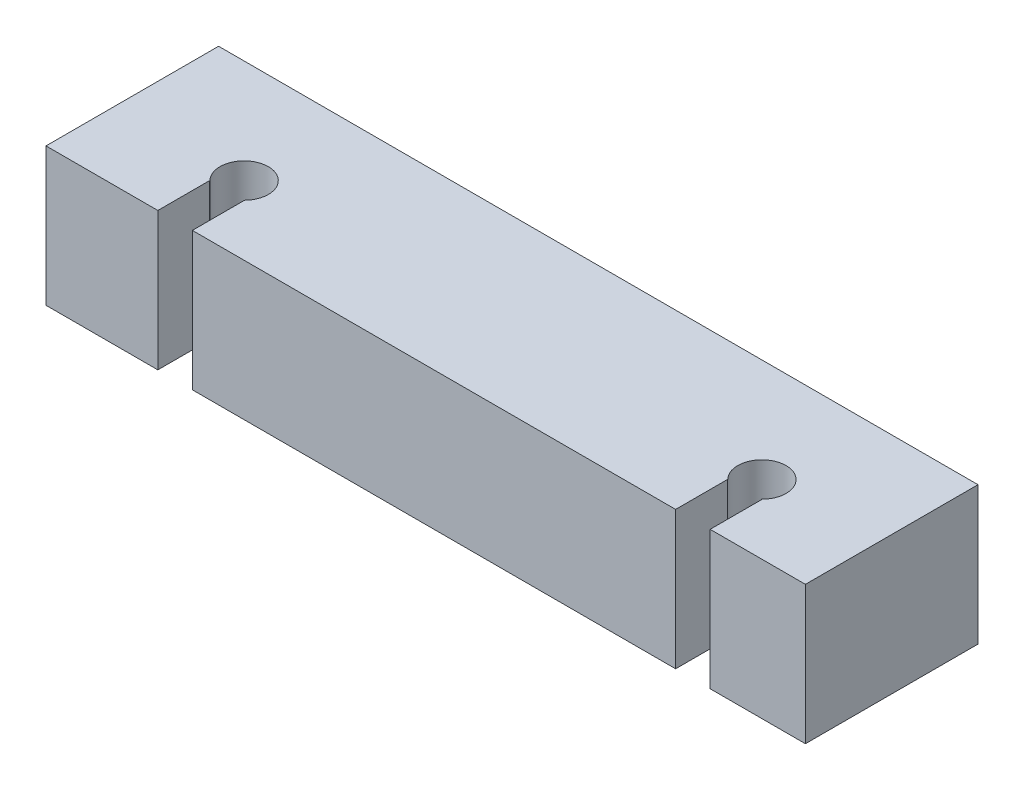
ISO-10303-21;
HEADER;
FILE_DESCRIPTION(('STEP AP214'),'2;1');
FILE_NAME('part.step','',(''),(''),'','','');
FILE_SCHEMA(('AUTOMOTIVE_DESIGN { 1 0 10303 214 1 1 1 1 }'));
ENDSEC;
DATA;
#1=APPLICATION_CONTEXT('core data for automotive mechanical design processes');
#2=APPLICATION_PROTOCOL_DEFINITION('international standard','automotive_design',2000,#1);
#3=PRODUCT_CONTEXT('',#1,'mechanical');
#4=PRODUCT('Part','Part','',(#3));
#5=PRODUCT_RELATED_PRODUCT_CATEGORY('part','',(#4));
#6=PRODUCT_DEFINITION_FORMATION('','',#4);
#7=PRODUCT_DEFINITION_CONTEXT('part definition',#1,'design');
#8=PRODUCT_DEFINITION('design','',#6,#7);
#9=PRODUCT_DEFINITION_SHAPE('','',#8);
#10=(LENGTH_UNIT() NAMED_UNIT(*) SI_UNIT(.MILLI.,.METRE.));
#11=(NAMED_UNIT(*) PLANE_ANGLE_UNIT() SI_UNIT($,.RADIAN.));
#12=(NAMED_UNIT(*) SI_UNIT($,.STERADIAN.) SOLID_ANGLE_UNIT());
#13=UNCERTAINTY_MEASURE_WITH_UNIT(LENGTH_MEASURE(1.E-05),#10,'distance_accuracy_value','');
#14=(GEOMETRIC_REPRESENTATION_CONTEXT(3) GLOBAL_UNCERTAINTY_ASSIGNED_CONTEXT((#13)) GLOBAL_UNIT_ASSIGNED_CONTEXT((#10,
#11,#12)) REPRESENTATION_CONTEXT('',''));
#15=CARTESIAN_POINT('',(0.,0.,0.));
#16=DIRECTION('',(0.,0.,1.));
#17=DIRECTION('',(1.,0.,0.));
#18=AXIS2_PLACEMENT_3D('',#15,#16,#17);
#19=CARTESIAN_POINT('',(0.,0.,100.));
#20=DIRECTION('',(0.,0.,-1.));
#21=DIRECTION('',(-1.,0.,0.));
#22=AXIS2_PLACEMENT_3D('',#19,#20,#21);
#23=PLANE('',#22);
#24=DIRECTION('',(0.,1.,0.));
#25=VECTOR('',#24,1.);
#26=CARTESIAN_POINT('',(-22.5,0.,100.));
#27=LINE('',#26,#25);
#28=CARTESIAN_POINT('',(-22.5,0.,100.));
#29=VERTEX_POINT('',#28);
#30=CARTESIAN_POINT('',(-22.5,10.,100.));
#31=VERTEX_POINT('',#30);
#32=EDGE_CURVE('E274',#29,#31,#27,.T.);
#33=ORIENTED_EDGE('',*,*,#32,.F.);
#34=DIRECTION('',(1.,0.,0.));
#35=VECTOR('',#34,1.);
#36=CARTESIAN_POINT('',(-72.5,0.,100.));
#37=LINE('',#36,#35);
#38=CARTESIAN_POINT('',(-14.4,0.,100.));
#39=VERTEX_POINT('',#38);
#40=EDGE_CURVE('E239',#29,#39,#37,.T.);
#41=ORIENTED_EDGE('',*,*,#40,.T.);
#42=DIRECTION('',(0.,1.,0.));
#43=VECTOR('',#42,1.);
#44=CARTESIAN_POINT('',(-14.4,0.,100.));
#45=LINE('',#44,#43);
#46=CARTESIAN_POINT('',(-14.4,10.,100.));
#47=VERTEX_POINT('',#46);
#48=EDGE_CURVE('E221',#39,#47,#45,.T.);
#49=ORIENTED_EDGE('',*,*,#48,.T.);
#50=DIRECTION('',(-1.,0.,0.));
#51=VECTOR('',#50,1.);
#52=CARTESIAN_POINT('',(-72.5,10.,100.));
#53=LINE('',#52,#51);
#54=EDGE_CURVE('E167',#47,#31,#53,.T.);
#55=ORIENTED_EDGE('',*,*,#54,.T.);
#56=EDGE_LOOP('',(#33,#41,#49,#55));
#57=FACE_BOUND('',#56,.T.);
#58=ADVANCED_FACE('F35',(#57),#23,.F.);
#59=CARTESIAN_POINT('',(0.,10.,0.));
#60=DIRECTION('',(0.,1.,0.));
#61=DIRECTION('',(0.,0.,1.));
#62=AXIS2_PLACEMENT_3D('',#59,#60,#61);
#63=PLANE('',#62);
#64=DIRECTION('',(0.,0.,1.));
#65=VECTOR('',#64,1.);
#66=CARTESIAN_POINT('',(32.5,10.,87.5));
#67=LINE('',#66,#65);
#68=CARTESIAN_POINT('',(32.5,10.,87.5));
#69=VERTEX_POINT('',#68);
#70=CARTESIAN_POINT('',(32.5,10.,100.));
#71=VERTEX_POINT('',#70);
#72=EDGE_CURVE('E50',#69,#71,#67,.T.);
#73=ORIENTED_EDGE('',*,*,#72,.F.);
#74=DIRECTION('',(-1.,0.,0.));
#75=VECTOR('',#74,1.);
#76=CARTESIAN_POINT('',(72.5,10.,87.5));
#77=LINE('',#76,#75);
#78=CARTESIAN_POINT('',(-22.5,10.,87.5));
#79=VERTEX_POINT('',#78);
#80=EDGE_CURVE('E57',#69,#79,#77,.T.);
#81=ORIENTED_EDGE('',*,*,#80,.T.);
#82=DIRECTION('',(0.,0.,-1.));
#83=VECTOR('',#82,1.);
#84=CARTESIAN_POINT('',(-22.5,10.,100.));
#85=LINE('',#84,#83);
#86=EDGE_CURVE('E278',#31,#79,#85,.T.);
#87=ORIENTED_EDGE('',*,*,#86,.F.);
#88=ORIENTED_EDGE('',*,*,#54,.F.);
#89=DIRECTION('',(0.,0.,-1.));
#90=VECTOR('',#89,1.);
#91=CARTESIAN_POINT('',(-14.4,10.,96.25));
#92=LINE('',#91,#90);
#93=CARTESIAN_POINT('',(-14.4,10.,96.25));
#94=VERTEX_POINT('',#93);
#95=EDGE_CURVE('E192',#47,#94,#92,.T.);
#96=ORIENTED_EDGE('',*,*,#95,.T.);
#97=DIRECTION('',(1.,0.,0.));
#98=VECTOR('',#97,1.);
#99=CARTESIAN_POINT('',(-14.4,10.,96.25));
#100=LINE('',#99,#98);
#101=CARTESIAN_POINT('',(-14.3747448713916,10.,96.25));
#102=VERTEX_POINT('',#101);
#103=EDGE_CURVE('E190',#94,#102,#100,.T.);
#104=ORIENTED_EDGE('',*,*,#103,.T.);
#105=CARTESIAN_POINT('',(-13.15,10.,95.));
#106=DIRECTION('',(0.,1.,0.));
#107=DIRECTION('',(0.,0.,1.));
#108=AXIS2_PLACEMENT_3D('',#105,#106,#107);
#109=CIRCLE('',#108,1.75);
#110=CARTESIAN_POINT('',(-11.9252551286084,10.,96.25));
#111=VERTEX_POINT('',#110);
#112=EDGE_CURVE('E188',#102,#111,#109,.F.);
#113=ORIENTED_EDGE('',*,*,#112,.T.);
#114=DIRECTION('',(1.,0.,0.));
#115=VECTOR('',#114,1.);
#116=CARTESIAN_POINT('',(-14.4,10.,96.25));
#117=LINE('',#116,#115);
#118=CARTESIAN_POINT('',(-11.9,10.,96.25));
#119=VERTEX_POINT('',#118);
#120=EDGE_CURVE('E184',#111,#119,#117,.T.);
#121=ORIENTED_EDGE('',*,*,#120,.T.);
#122=DIRECTION('',(0.,0.,1.));
#123=VECTOR('',#122,1.);
#124=CARTESIAN_POINT('',(-11.9,10.,96.25));
#125=LINE('',#124,#123);
#126=CARTESIAN_POINT('',(-11.9,10.,100.));
#127=VERTEX_POINT('',#126);
#128=EDGE_CURVE('E186',#119,#127,#125,.T.);
#129=ORIENTED_EDGE('',*,*,#128,.T.);
#130=CARTESIAN_POINT('',(23.1,10.,100.));
#131=VERTEX_POINT('',#130);
#132=EDGE_CURVE('E174',#131,#127,#53,.T.);
#133=ORIENTED_EDGE('',*,*,#132,.F.);
#134=DIRECTION('',(0.,0.,-1.));
#135=VECTOR('',#134,1.);
#136=CARTESIAN_POINT('',(23.1,10.,96.25));
#137=LINE('',#136,#135);
#138=CARTESIAN_POINT('',(23.1,10.,96.25));
#139=VERTEX_POINT('',#138);
#140=EDGE_CURVE('E182',#131,#139,#137,.T.);
#141=ORIENTED_EDGE('',*,*,#140,.T.);
#142=DIRECTION('',(1.,0.,0.));
#143=VECTOR('',#142,1.);
#144=CARTESIAN_POINT('',(23.1,10.,96.25));
#145=LINE('',#144,#143);
#146=CARTESIAN_POINT('',(23.1252551286084,10.,96.25));
#147=VERTEX_POINT('',#146);
#148=EDGE_CURVE('E180',#139,#147,#145,.T.);
#149=ORIENTED_EDGE('',*,*,#148,.T.);
#150=CARTESIAN_POINT('',(24.35,10.,95.));
#151=DIRECTION('',(0.,1.,0.));
#152=DIRECTION('',(0.,0.,1.));
#153=AXIS2_PLACEMENT_3D('',#150,#151,#152);
#154=CIRCLE('',#153,1.75);
#155=CARTESIAN_POINT('',(25.5747448713916,10.,96.25));
#156=VERTEX_POINT('',#155);
#157=EDGE_CURVE('E178',#147,#156,#154,.F.);
#158=ORIENTED_EDGE('',*,*,#157,.T.);
#159=DIRECTION('',(1.,0.,0.));
#160=VECTOR('',#159,1.);
#161=CARTESIAN_POINT('',(23.1,10.,96.25));
#162=LINE('',#161,#160);
#163=CARTESIAN_POINT('',(25.6,10.,96.25));
#164=VERTEX_POINT('',#163);
#165=EDGE_CURVE('E173',#156,#164,#162,.T.);
#166=ORIENTED_EDGE('',*,*,#165,.T.);
#167=DIRECTION('',(0.,0.,1.));
#168=VECTOR('',#167,1.);
#169=CARTESIAN_POINT('',(25.6,10.,96.25));
#170=LINE('',#169,#168);
#171=CARTESIAN_POINT('',(25.6,10.,100.));
#172=VERTEX_POINT('',#171);
#173=EDGE_CURVE('E176',#164,#172,#170,.T.);
#174=ORIENTED_EDGE('',*,*,#173,.T.);
#175=EDGE_CURVE('E158',#71,#172,#53,.T.);
#176=ORIENTED_EDGE('',*,*,#175,.F.);
#177=EDGE_LOOP('',(#73,#81,#87,#88,#96,#104,#113,#121,#129,#133,#141,#149,#158,#166,#174,#176));
#178=FACE_BOUND('',#177,.T.);
#179=ADVANCED_FACE('F156',(#178),#63,.T.);
#180=CARTESIAN_POINT('',(0.,0.,0.));
#181=DIRECTION('',(0.,1.,0.));
#182=DIRECTION('',(0.,0.,1.));
#183=AXIS2_PLACEMENT_3D('',#180,#181,#182);
#184=PLANE('',#183);
#185=DIRECTION('',(1.,0.,0.));
#186=VECTOR('',#185,1.);
#187=CARTESIAN_POINT('',(72.5,0.,87.5));
#188=LINE('',#187,#186);
#189=CARTESIAN_POINT('',(-22.5,0.,87.5));
#190=VERTEX_POINT('',#189);
#191=CARTESIAN_POINT('',(32.5,0.,87.5));
#192=VERTEX_POINT('',#191);
#193=EDGE_CURVE('E164',#190,#192,#188,.T.);
#194=ORIENTED_EDGE('',*,*,#193,.T.);
#195=DIRECTION('',(0.,0.,-1.));
#196=VECTOR('',#195,1.);
#197=CARTESIAN_POINT('',(32.5,0.,87.5));
#198=LINE('',#197,#196);
#199=CARTESIAN_POINT('',(32.5,0.,100.));
#200=VERTEX_POINT('',#199);
#201=EDGE_CURVE('E150',#200,#192,#198,.T.);
#202=ORIENTED_EDGE('',*,*,#201,.F.);
#203=CARTESIAN_POINT('',(25.6,0.,100.));
#204=VERTEX_POINT('',#203);
#205=EDGE_CURVE('E238',#204,#200,#37,.T.);
#206=ORIENTED_EDGE('',*,*,#205,.F.);
#207=DIRECTION('',(0.,0.,-1.));
#208=VECTOR('',#207,1.);
#209=CARTESIAN_POINT('',(25.6,0.,0.));
#210=LINE('',#209,#208);
#211=CARTESIAN_POINT('',(25.6,0.,96.25));
#212=VERTEX_POINT('',#211);
#213=EDGE_CURVE('E218',#204,#212,#210,.T.);
#214=ORIENTED_EDGE('',*,*,#213,.T.);
#215=DIRECTION('',(-1.,0.,0.));
#216=VECTOR('',#215,1.);
#217=CARTESIAN_POINT('',(0.,0.,96.25));
#218=LINE('',#217,#216);
#219=CARTESIAN_POINT('',(25.5747448713916,0.,96.25));
#220=VERTEX_POINT('',#219);
#221=EDGE_CURVE('E209',#212,#220,#218,.T.);
#222=ORIENTED_EDGE('',*,*,#221,.T.);
#223=CARTESIAN_POINT('',(24.35,0.,95.));
#224=DIRECTION('',(0.,1.,0.));
#225=DIRECTION('',(0.,0.,1.));
#226=AXIS2_PLACEMENT_3D('',#223,#224,#225);
#227=CIRCLE('',#226,1.75);
#228=CARTESIAN_POINT('',(23.1252551286084,0.,96.25));
#229=VERTEX_POINT('',#228);
#230=EDGE_CURVE('E232',#220,#229,#227,.T.);
#231=ORIENTED_EDGE('',*,*,#230,.T.);
#232=CARTESIAN_POINT('',(23.1,0.,96.25));
#233=VERTEX_POINT('',#232);
#234=EDGE_CURVE('E206',#229,#233,#218,.T.);
#235=ORIENTED_EDGE('',*,*,#234,.T.);
#236=DIRECTION('',(0.,0.,1.));
#237=VECTOR('',#236,1.);
#238=CARTESIAN_POINT('',(23.1,0.,0.));
#239=LINE('',#238,#237);
#240=CARTESIAN_POINT('',(23.1,0.,100.));
#241=VERTEX_POINT('',#240);
#242=EDGE_CURVE('E213',#233,#241,#239,.T.);
#243=ORIENTED_EDGE('',*,*,#242,.T.);
#244=CARTESIAN_POINT('',(-11.9,0.,100.));
#245=VERTEX_POINT('',#244);
#246=EDGE_CURVE('E242',#245,#241,#37,.T.);
#247=ORIENTED_EDGE('',*,*,#246,.F.);
#248=DIRECTION('',(0.,0.,-1.));
#249=VECTOR('',#248,1.);
#250=CARTESIAN_POINT('',(-11.9,0.,0.));
#251=LINE('',#250,#249);
#252=CARTESIAN_POINT('',(-11.9,0.,96.25));
#253=VERTEX_POINT('',#252);
#254=EDGE_CURVE('E229',#245,#253,#251,.T.);
#255=ORIENTED_EDGE('',*,*,#254,.T.);
#256=DIRECTION('',(-1.,0.,0.));
#257=VECTOR('',#256,1.);
#258=CARTESIAN_POINT('',(0.,0.,96.25));
#259=LINE('',#258,#257);
#260=CARTESIAN_POINT('',(-11.9252551286084,0.,96.25));
#261=VERTEX_POINT('',#260);
#262=EDGE_CURVE('E205',#253,#261,#259,.T.);
#263=ORIENTED_EDGE('',*,*,#262,.T.);
#264=CARTESIAN_POINT('',(-13.15,0.,95.));
#265=DIRECTION('',(0.,1.,0.));
#266=DIRECTION('',(0.,0.,1.));
#267=AXIS2_PLACEMENT_3D('',#264,#265,#266);
#268=CIRCLE('',#267,1.75);
#269=CARTESIAN_POINT('',(-14.3747448713916,0.,96.25));
#270=VERTEX_POINT('',#269);
#271=EDGE_CURVE('E235',#261,#270,#268,.T.);
#272=ORIENTED_EDGE('',*,*,#271,.T.);
#273=CARTESIAN_POINT('',(-14.4,0.,96.25));
#274=VERTEX_POINT('',#273);
#275=EDGE_CURVE('E197',#270,#274,#259,.T.);
#276=ORIENTED_EDGE('',*,*,#275,.T.);
#277=DIRECTION('',(0.,0.,1.));
#278=VECTOR('',#277,1.);
#279=CARTESIAN_POINT('',(-14.4,0.,0.));
#280=LINE('',#279,#278);
#281=EDGE_CURVE('E224',#274,#39,#280,.T.);
#282=ORIENTED_EDGE('',*,*,#281,.T.);
#283=ORIENTED_EDGE('',*,*,#40,.F.);
#284=DIRECTION('',(0.,0.,1.));
#285=VECTOR('',#284,1.);
#286=CARTESIAN_POINT('',(-22.5,0.,87.5));
#287=LINE('',#286,#285);
#288=EDGE_CURVE('E165',#190,#29,#287,.T.);
#289=ORIENTED_EDGE('',*,*,#288,.F.);
#290=EDGE_LOOP('',(#194,#202,#206,#214,#222,#231,#235,#243,#247,#255,#263,#272,#276,#282,#283,#289));
#291=FACE_BOUND('',#290,.T.);
#292=ADVANCED_FACE('F37',(#291),#184,.F.);
#293=CARTESIAN_POINT('',(0.,0.,87.5));
#294=DIRECTION('',(0.,0.,1.));
#295=DIRECTION('',(1.,0.,0.));
#296=AXIS2_PLACEMENT_3D('',#293,#294,#295);
#297=PLANE('',#296);
#298=ORIENTED_EDGE('',*,*,#80,.F.);
#299=DIRECTION('',(0.,1.,0.));
#300=VECTOR('',#299,1.);
#301=CARTESIAN_POINT('',(32.5,10.,87.5));
#302=LINE('',#301,#300);
#303=EDGE_CURVE('E147',#192,#69,#302,.T.);
#304=ORIENTED_EDGE('',*,*,#303,.F.);
#305=ORIENTED_EDGE('',*,*,#193,.F.);
#306=DIRECTION('',(0.,-1.,0.));
#307=VECTOR('',#306,1.);
#308=CARTESIAN_POINT('',(-22.5,10.,87.5));
#309=LINE('',#308,#307);
#310=EDGE_CURVE('E163',#79,#190,#309,.T.);
#311=ORIENTED_EDGE('',*,*,#310,.F.);
#312=EDGE_LOOP('',(#298,#304,#305,#311));
#313=FACE_BOUND('',#312,.T.);
#314=ADVANCED_FACE('F162',(#313),#297,.F.);
#315=ORIENTED_EDGE('',*,*,#132,.T.);
#316=DIRECTION('',(0.,-1.,0.));
#317=VECTOR('',#316,1.);
#318=CARTESIAN_POINT('',(-11.9,0.,100.));
#319=LINE('',#318,#317);
#320=EDGE_CURVE('E227',#127,#245,#319,.T.);
#321=ORIENTED_EDGE('',*,*,#320,.T.);
#322=ORIENTED_EDGE('',*,*,#246,.T.);
#323=DIRECTION('',(0.,1.,0.));
#324=VECTOR('',#323,1.);
#325=CARTESIAN_POINT('',(23.1,0.,100.));
#326=LINE('',#325,#324);
#327=EDGE_CURVE('E210',#241,#131,#326,.T.);
#328=ORIENTED_EDGE('',*,*,#327,.T.);
#329=EDGE_LOOP('',(#315,#321,#322,#328));
#330=FACE_BOUND('',#329,.T.);
#331=ADVANCED_FACE('F316',(#330),#23,.F.);
#332=ORIENTED_EDGE('',*,*,#205,.T.);
#333=DIRECTION('',(0.,-1.,0.));
#334=VECTOR('',#333,1.);
#335=CARTESIAN_POINT('',(32.5,10.,100.));
#336=LINE('',#335,#334);
#337=EDGE_CURVE('E159',#71,#200,#336,.T.);
#338=ORIENTED_EDGE('',*,*,#337,.F.);
#339=ORIENTED_EDGE('',*,*,#175,.T.);
#340=DIRECTION('',(0.,-1.,0.));
#341=VECTOR('',#340,1.);
#342=CARTESIAN_POINT('',(25.6,0.,100.));
#343=LINE('',#342,#341);
#344=EDGE_CURVE('E216',#172,#204,#343,.T.);
#345=ORIENTED_EDGE('',*,*,#344,.T.);
#346=EDGE_LOOP('',(#332,#338,#339,#345));
#347=FACE_BOUND('',#346,.T.);
#348=ADVANCED_FACE('F272',(#347),#23,.F.);
#349=CARTESIAN_POINT('',(24.35,60.,95.));
#350=DIRECTION('',(0.,-1.,0.));
#351=DIRECTION('',(0.,0.,-1.));
#352=AXIS2_PLACEMENT_3D('',#349,#350,#351);
#353=CYLINDRICAL_SURFACE('',#352,1.75);
#354=ORIENTED_EDGE('',*,*,#157,.F.);
#355=DIRECTION('',(0.,-1.,0.));
#356=VECTOR('',#355,1.);
#357=CARTESIAN_POINT('',(23.1252551286084,60.,96.25));
#358=LINE('',#357,#356);
#359=EDGE_CURVE('E43',#147,#229,#358,.T.);
#360=ORIENTED_EDGE('',*,*,#359,.T.);
#361=ORIENTED_EDGE('',*,*,#230,.F.);
#362=DIRECTION('',(0.,-1.,0.));
#363=VECTOR('',#362,1.);
#364=CARTESIAN_POINT('',(25.5747448713916,60.,96.25));
#365=LINE('',#364,#363);
#366=EDGE_CURVE('E11',#220,#156,#365,.F.);
#367=ORIENTED_EDGE('',*,*,#366,.T.);
#368=EDGE_LOOP('',(#354,#360,#361,#367));
#369=FACE_BOUND('',#368,.T.);
#370=ADVANCED_FACE('F251',(#369),#353,.F.);
#371=CARTESIAN_POINT('',(-13.15,60.,95.));
#372=DIRECTION('',(0.,-1.,0.));
#373=DIRECTION('',(0.,0.,-1.));
#374=AXIS2_PLACEMENT_3D('',#371,#372,#373);
#375=CYLINDRICAL_SURFACE('',#374,1.75);
#376=ORIENTED_EDGE('',*,*,#112,.F.);
#377=DIRECTION('',(0.,-1.,0.));
#378=VECTOR('',#377,1.);
#379=CARTESIAN_POINT('',(-14.3747448713916,60.,96.25));
#380=LINE('',#379,#378);
#381=EDGE_CURVE('E241',#102,#270,#380,.T.);
#382=ORIENTED_EDGE('',*,*,#381,.T.);
#383=ORIENTED_EDGE('',*,*,#271,.F.);
#384=DIRECTION('',(0.,-1.,0.));
#385=VECTOR('',#384,1.);
#386=CARTESIAN_POINT('',(-11.9252551286084,60.,96.25));
#387=LINE('',#386,#385);
#388=EDGE_CURVE('E244',#261,#111,#387,.F.);
#389=ORIENTED_EDGE('',*,*,#388,.T.);
#390=EDGE_LOOP('',(#376,#382,#383,#389));
#391=FACE_BOUND('',#390,.T.);
#392=ADVANCED_FACE('F300',(#391),#375,.F.);
#393=CARTESIAN_POINT('',(-14.4,60.,96.25));
#394=DIRECTION('',(0.,0.,-1.));
#395=DIRECTION('',(-1.,0.,0.));
#396=AXIS2_PLACEMENT_3D('',#393,#394,#395);
#397=PLANE('',#396);
#398=ORIENTED_EDGE('',*,*,#103,.F.);
#399=DIRECTION('',(0.,-1.,0.));
#400=VECTOR('',#399,1.);
#401=CARTESIAN_POINT('',(-14.4,60.,96.25));
#402=LINE('',#401,#400);
#403=EDGE_CURVE('E198',#94,#274,#402,.T.);
#404=ORIENTED_EDGE('',*,*,#403,.T.);
#405=ORIENTED_EDGE('',*,*,#275,.F.);
#406=ORIENTED_EDGE('',*,*,#381,.F.);
#407=EDGE_LOOP('',(#398,#404,#405,#406));
#408=FACE_BOUND('',#407,.T.);
#409=ADVANCED_FACE('F296',(#408),#397,.F.);
#410=CARTESIAN_POINT('',(-14.4,60.,96.25));
#411=DIRECTION('',(-1.,0.,0.));
#412=DIRECTION('',(0.,0.,1.));
#413=AXIS2_PLACEMENT_3D('',#410,#411,#412);
#414=PLANE('',#413);
#415=ORIENTED_EDGE('',*,*,#95,.F.);
#416=ORIENTED_EDGE('',*,*,#48,.F.);
#417=ORIENTED_EDGE('',*,*,#281,.F.);
#418=ORIENTED_EDGE('',*,*,#403,.F.);
#419=EDGE_LOOP('',(#415,#416,#417,#418));
#420=FACE_BOUND('',#419,.T.);
#421=ADVANCED_FACE('F290',(#420),#414,.F.);
#422=CARTESIAN_POINT('',(-11.9,60.,96.25));
#423=DIRECTION('',(1.,0.,0.));
#424=DIRECTION('',(0.,0.,-1.));
#425=AXIS2_PLACEMENT_3D('',#422,#423,#424);
#426=PLANE('',#425);
#427=ORIENTED_EDGE('',*,*,#128,.F.);
#428=DIRECTION('',(0.,-1.,0.));
#429=VECTOR('',#428,1.);
#430=CARTESIAN_POINT('',(-11.9,60.,96.25));
#431=LINE('',#430,#429);
#432=EDGE_CURVE('E195',#119,#253,#431,.T.);
#433=ORIENTED_EDGE('',*,*,#432,.T.);
#434=ORIENTED_EDGE('',*,*,#254,.F.);
#435=ORIENTED_EDGE('',*,*,#320,.F.);
#436=EDGE_LOOP('',(#427,#433,#434,#435));
#437=FACE_BOUND('',#436,.T.);
#438=ADVANCED_FACE('F310',(#437),#426,.F.);
#439=ORIENTED_EDGE('',*,*,#120,.F.);
#440=ORIENTED_EDGE('',*,*,#388,.F.);
#441=ORIENTED_EDGE('',*,*,#262,.F.);
#442=ORIENTED_EDGE('',*,*,#432,.F.);
#443=EDGE_LOOP('',(#439,#440,#441,#442));
#444=FACE_BOUND('',#443,.T.);
#445=ADVANCED_FACE('F305',(#444),#397,.F.);
#446=CARTESIAN_POINT('',(23.1,60.,96.25));
#447=DIRECTION('',(0.,0.,-1.));
#448=DIRECTION('',(-1.,0.,0.));
#449=AXIS2_PLACEMENT_3D('',#446,#447,#448);
#450=PLANE('',#449);
#451=ORIENTED_EDGE('',*,*,#148,.F.);
#452=DIRECTION('',(0.,-1.,0.));
#453=VECTOR('',#452,1.);
#454=CARTESIAN_POINT('',(23.1,60.,96.25));
#455=LINE('',#454,#453);
#456=EDGE_CURVE('E194',#139,#233,#455,.T.);
#457=ORIENTED_EDGE('',*,*,#456,.T.);
#458=ORIENTED_EDGE('',*,*,#234,.F.);
#459=ORIENTED_EDGE('',*,*,#359,.F.);
#460=EDGE_LOOP('',(#451,#457,#458,#459));
#461=FACE_BOUND('',#460,.T.);
#462=ADVANCED_FACE('F254',(#461),#450,.F.);
#463=CARTESIAN_POINT('',(23.1,60.,96.25));
#464=DIRECTION('',(-1.,0.,0.));
#465=DIRECTION('',(0.,0.,1.));
#466=AXIS2_PLACEMENT_3D('',#463,#464,#465);
#467=PLANE('',#466);
#468=ORIENTED_EDGE('',*,*,#140,.F.);
#469=ORIENTED_EDGE('',*,*,#327,.F.);
#470=ORIENTED_EDGE('',*,*,#242,.F.);
#471=ORIENTED_EDGE('',*,*,#456,.F.);
#472=EDGE_LOOP('',(#468,#469,#470,#471));
#473=FACE_BOUND('',#472,.T.);
#474=ADVANCED_FACE('F319',(#473),#467,.F.);
#475=CARTESIAN_POINT('',(25.6,60.,96.25));
#476=DIRECTION('',(1.,0.,0.));
#477=DIRECTION('',(0.,0.,-1.));
#478=AXIS2_PLACEMENT_3D('',#475,#476,#477);
#479=PLANE('',#478);
#480=ORIENTED_EDGE('',*,*,#173,.F.);
#481=DIRECTION('',(0.,-1.,0.));
#482=VECTOR('',#481,1.);
#483=CARTESIAN_POINT('',(25.6,60.,96.25));
#484=LINE('',#483,#482);
#485=EDGE_CURVE('E200',#164,#212,#484,.T.);
#486=ORIENTED_EDGE('',*,*,#485,.T.);
#487=ORIENTED_EDGE('',*,*,#213,.F.);
#488=ORIENTED_EDGE('',*,*,#344,.F.);
#489=EDGE_LOOP('',(#480,#486,#487,#488));
#490=FACE_BOUND('',#489,.T.);
#491=ADVANCED_FACE('F269',(#490),#479,.F.);
#492=ORIENTED_EDGE('',*,*,#165,.F.);
#493=ORIENTED_EDGE('',*,*,#366,.F.);
#494=ORIENTED_EDGE('',*,*,#221,.F.);
#495=ORIENTED_EDGE('',*,*,#485,.F.);
#496=EDGE_LOOP('',(#492,#493,#494,#495));
#497=FACE_BOUND('',#496,.T.);
#498=ADVANCED_FACE('F265',(#497),#450,.F.);
#499=CARTESIAN_POINT('',(-22.5,0.,0.));
#500=DIRECTION('',(-1.,0.,0.));
#501=DIRECTION('',(0.,0.,1.));
#502=AXIS2_PLACEMENT_3D('',#499,#500,#501);
#503=PLANE('',#502);
#504=ORIENTED_EDGE('',*,*,#32,.T.);
#505=ORIENTED_EDGE('',*,*,#86,.T.);
#506=ORIENTED_EDGE('',*,*,#310,.T.);
#507=ORIENTED_EDGE('',*,*,#288,.T.);
#508=EDGE_LOOP('',(#504,#505,#506,#507));
#509=FACE_BOUND('',#508,.T.);
#510=ADVANCED_FACE('F281',(#509),#503,.T.);
#511=CARTESIAN_POINT('',(32.5,0.,0.));
#512=DIRECTION('',(-1.,0.,0.));
#513=DIRECTION('',(0.,0.,1.));
#514=AXIS2_PLACEMENT_3D('',#511,#512,#513);
#515=PLANE('',#514);
#516=ORIENTED_EDGE('',*,*,#303,.T.);
#517=ORIENTED_EDGE('',*,*,#72,.T.);
#518=ORIENTED_EDGE('',*,*,#337,.T.);
#519=ORIENTED_EDGE('',*,*,#201,.T.);
#520=EDGE_LOOP('',(#516,#517,#518,#519));
#521=FACE_BOUND('',#520,.T.);
#522=ADVANCED_FACE('F148',(#521),#515,.F.);
#523=CLOSED_SHELL('',(#58,#179,#292,#314,#331,#348,#370,#392,#409,#421,#438,#445,#462,#474,#491,
#498,#510,#522));
#524=MANIFOLD_SOLID_BREP('B2',#523);
#525=ADVANCED_BREP_SHAPE_REPRESENTATION('',(#18,#524),#14);
#526=SHAPE_DEFINITION_REPRESENTATION(#9,#525);
ENDSEC;
END-ISO-10303-21;
